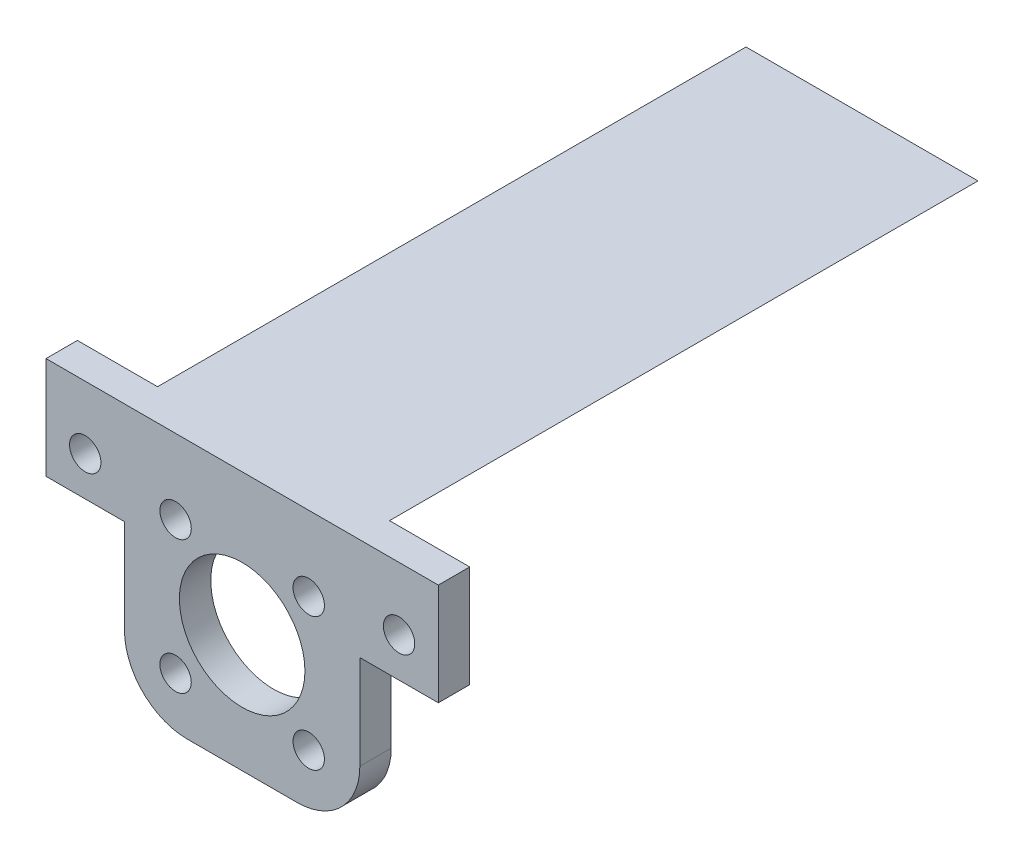
ISO-10303-21;
HEADER;
FILE_DESCRIPTION(('STEP AP214'),'2;1');
FILE_NAME('part.step','',(''),(''),'','','');
FILE_SCHEMA(('AUTOMOTIVE_DESIGN { 1 0 10303 214 1 1 1 1 }'));
ENDSEC;
DATA;
#1=APPLICATION_CONTEXT('core data for automotive mechanical design processes');
#2=APPLICATION_PROTOCOL_DEFINITION('international standard','automotive_design',2000,#1);
#3=PRODUCT_CONTEXT('',#1,'mechanical');
#4=PRODUCT('Part','Part','',(#3));
#5=PRODUCT_RELATED_PRODUCT_CATEGORY('part','',(#4));
#6=PRODUCT_DEFINITION_FORMATION('','',#4);
#7=PRODUCT_DEFINITION_CONTEXT('part definition',#1,'design');
#8=PRODUCT_DEFINITION('design','',#6,#7);
#9=PRODUCT_DEFINITION_SHAPE('','',#8);
#10=(LENGTH_UNIT() NAMED_UNIT(*) SI_UNIT(.MILLI.,.METRE.));
#11=(NAMED_UNIT(*) PLANE_ANGLE_UNIT() SI_UNIT($,.RADIAN.));
#12=(NAMED_UNIT(*) SI_UNIT($,.STERADIAN.) SOLID_ANGLE_UNIT());
#13=UNCERTAINTY_MEASURE_WITH_UNIT(LENGTH_MEASURE(1.E-05),#10,'distance_accuracy_value','');
#14=(GEOMETRIC_REPRESENTATION_CONTEXT(3) GLOBAL_UNCERTAINTY_ASSIGNED_CONTEXT((#13)) GLOBAL_UNIT_ASSIGNED_CONTEXT((#10,
#11,#12)) REPRESENTATION_CONTEXT('',''));
#15=CARTESIAN_POINT('',(0.,0.,0.));
#16=DIRECTION('',(0.,0.,1.));
#17=DIRECTION('',(1.,0.,0.));
#18=AXIS2_PLACEMENT_3D('',#15,#16,#17);
#19=CARTESIAN_POINT('',(-7.,8.,0.));
#20=DIRECTION('',(0.,0.,1.));
#21=DIRECTION('',(1.,0.,0.));
#22=AXIS2_PLACEMENT_3D('',#19,#20,#21);
#23=PLANE('',#22);
#24=CARTESIAN_POINT('',(20.,25.,0.));
#25=DIRECTION('',(0.,0.,1.));
#26=DIRECTION('',(-1.,0.,0.));
#27=AXIS2_PLACEMENT_3D('',#24,#25,#26);
#28=CIRCLE('',#27,2.);
#29=CARTESIAN_POINT('',(18.,25.,0.));
#30=VERTEX_POINT('',#29);
#31=EDGE_CURVE('E159',#30,#30,#28,.T.);
#32=ORIENTED_EDGE('',*,*,#31,.T.);
#33=EDGE_LOOP('',(#32));
#34=FACE_BOUND('',#33,.T.);
#35=CARTESIAN_POINT('',(8.48528137423857,23.4852813742386,0.));
#36=DIRECTION('',(0.,0.,1.));
#37=DIRECTION('',(-1.,0.,0.));
#38=AXIS2_PLACEMENT_3D('',#35,#36,#37);
#39=CIRCLE('',#38,2.);
#40=CARTESIAN_POINT('',(6.48528137423857,23.4852813742386,0.));
#41=VERTEX_POINT('',#40);
#42=EDGE_CURVE('E169',#41,#41,#39,.T.);
#43=ORIENTED_EDGE('',*,*,#42,.T.);
#44=EDGE_LOOP('',(#43));
#45=FACE_BOUND('',#44,.T.);
#46=CARTESIAN_POINT('',(8.48528137423857,6.51471862576143,0.));
#47=DIRECTION('',(0.,0.,1.));
#48=DIRECTION('',(-1.,0.,0.));
#49=AXIS2_PLACEMENT_3D('',#46,#47,#48);
#50=CIRCLE('',#49,2.);
#51=CARTESIAN_POINT('',(6.48528137423857,6.51471862576143,0.));
#52=VERTEX_POINT('',#51);
#53=EDGE_CURVE('E174',#52,#52,#50,.T.);
#54=ORIENTED_EDGE('',*,*,#53,.T.);
#55=EDGE_LOOP('',(#54));
#56=FACE_BOUND('',#55,.T.);
#57=CARTESIAN_POINT('',(-20.,25.,0.));
#58=DIRECTION('',(0.,0.,1.));
#59=DIRECTION('',(1.,0.,0.));
#60=AXIS2_PLACEMENT_3D('',#57,#58,#59);
#61=CIRCLE('',#60,2.);
#62=CARTESIAN_POINT('',(-18.,25.,0.));
#63=VERTEX_POINT('',#62);
#64=EDGE_CURVE('E180',#63,#63,#61,.T.);
#65=ORIENTED_EDGE('',*,*,#64,.T.);
#66=EDGE_LOOP('',(#65));
#67=FACE_BOUND('',#66,.T.);
#68=CARTESIAN_POINT('',(-8.48528137423857,23.4852813742386,0.));
#69=DIRECTION('',(0.,0.,1.));
#70=DIRECTION('',(1.,0.,0.));
#71=AXIS2_PLACEMENT_3D('',#68,#69,#70);
#72=CIRCLE('',#71,2.);
#73=CARTESIAN_POINT('',(-6.48528137423857,23.4852813742386,0.));
#74=VERTEX_POINT('',#73);
#75=EDGE_CURVE('E186',#74,#74,#72,.T.);
#76=ORIENTED_EDGE('',*,*,#75,.T.);
#77=EDGE_LOOP('',(#76));
#78=FACE_BOUND('',#77,.T.);
#79=CARTESIAN_POINT('',(-8.48528137423857,6.51471862576143,0.));
#80=DIRECTION('',(0.,0.,1.));
#81=DIRECTION('',(1.,0.,0.));
#82=AXIS2_PLACEMENT_3D('',#79,#80,#81);
#83=CIRCLE('',#82,2.);
#84=CARTESIAN_POINT('',(-6.48528137423857,6.51471862576143,0.));
#85=VERTEX_POINT('',#84);
#86=EDGE_CURVE('E192',#85,#85,#83,.T.);
#87=ORIENTED_EDGE('',*,*,#86,.T.);
#88=EDGE_LOOP('',(#87));
#89=FACE_BOUND('',#88,.T.);
#90=CARTESIAN_POINT('',(0.,15.,0.));
#91=DIRECTION('',(0.,0.,1.));
#92=DIRECTION('',(1.,0.,0.));
#93=AXIS2_PLACEMENT_3D('',#90,#91,#92);
#94=CIRCLE('',#93,8.);
#95=CARTESIAN_POINT('',(8.,15.,0.));
#96=VERTEX_POINT('',#95);
#97=EDGE_CURVE('E198',#96,#96,#94,.T.);
#98=ORIENTED_EDGE('',*,*,#97,.T.);
#99=EDGE_LOOP('',(#98));
#100=FACE_BOUND('',#99,.T.);
#101=DIRECTION('',(-0.887010833178224,-0.461748613235029,0.));
#102=VECTOR('',#101,1.);
#103=CARTESIAN_POINT('',(-10.3640068647247,19.9090719509428,0.));
#104=LINE('',#103,#102);
#105=CARTESIAN_POINT('',(14.78343194298,33.,0.));
#106=VERTEX_POINT('',#105);
#107=CARTESIAN_POINT('',(9.02048556206639,30.,0.));
#108=VERTEX_POINT('',#107);
#109=EDGE_CURVE('E158',#106,#108,#104,.T.);
#110=ORIENTED_EDGE('',*,*,#109,.F.);
#111=DIRECTION('',(-1.,0.,0.));
#112=VECTOR('',#111,1.);
#113=CARTESIAN_POINT('',(-25.,33.,0.));
#114=LINE('',#113,#112);
#115=CARTESIAN_POINT('',(25.,33.,0.));
#116=VERTEX_POINT('',#115);
#117=EDGE_CURVE('E211',#116,#106,#114,.T.);
#118=ORIENTED_EDGE('',*,*,#117,.F.);
#119=DIRECTION('',(0.,1.,0.));
#120=VECTOR('',#119,1.);
#121=CARTESIAN_POINT('',(25.,33.,0.));
#122=LINE('',#121,#120);
#123=CARTESIAN_POINT('',(25.,20.,0.));
#124=VERTEX_POINT('',#123);
#125=EDGE_CURVE('E246',#124,#116,#122,.T.);
#126=ORIENTED_EDGE('',*,*,#125,.F.);
#127=DIRECTION('',(1.,0.,0.));
#128=VECTOR('',#127,1.);
#129=CARTESIAN_POINT('',(25.,20.,0.));
#130=LINE('',#129,#128);
#131=CARTESIAN_POINT('',(15.,20.,0.));
#132=VERTEX_POINT('',#131);
#133=EDGE_CURVE('E244',#132,#124,#130,.T.);
#134=ORIENTED_EDGE('',*,*,#133,.F.);
#135=DIRECTION('',(0.,1.,0.));
#136=VECTOR('',#135,1.);
#137=CARTESIAN_POINT('',(15.,20.,0.));
#138=LINE('',#137,#136);
#139=CARTESIAN_POINT('',(15.,8.00000000000006,0.));
#140=VERTEX_POINT('',#139);
#141=EDGE_CURVE('E242',#140,#132,#138,.T.);
#142=ORIENTED_EDGE('',*,*,#141,.F.);
#143=CARTESIAN_POINT('',(7.,8.,0.));
#144=DIRECTION('',(0.,0.,1.));
#145=DIRECTION('',(-1.,0.,0.));
#146=AXIS2_PLACEMENT_3D('',#143,#144,#145);
#147=CIRCLE('',#146,8.);
#148=CARTESIAN_POINT('',(6.99999999999994,0.,0.));
#149=VERTEX_POINT('',#148);
#150=EDGE_CURVE('E240',#149,#140,#147,.T.);
#151=ORIENTED_EDGE('',*,*,#150,.F.);
#152=DIRECTION('',(1.,0.,0.));
#153=VECTOR('',#152,1.);
#154=CARTESIAN_POINT('',(-6.99999999999994,0.,0.));
#155=LINE('',#154,#153);
#156=CARTESIAN_POINT('',(-6.99999999999994,0.,0.));
#157=VERTEX_POINT('',#156);
#158=EDGE_CURVE('E238',#157,#149,#155,.T.);
#159=ORIENTED_EDGE('',*,*,#158,.F.);
#160=CARTESIAN_POINT('',(-7.,8.,0.));
#161=DIRECTION('',(0.,0.,1.));
#162=DIRECTION('',(1.,0.,0.));
#163=AXIS2_PLACEMENT_3D('',#160,#161,#162);
#164=CIRCLE('',#163,8.);
#165=CARTESIAN_POINT('',(-15.,8.00000000000006,0.));
#166=VERTEX_POINT('',#165);
#167=EDGE_CURVE('E236',#166,#157,#164,.T.);
#168=ORIENTED_EDGE('',*,*,#167,.F.);
#169=DIRECTION('',(0.,-1.,0.));
#170=VECTOR('',#169,1.);
#171=CARTESIAN_POINT('',(-15.,20.,0.));
#172=LINE('',#171,#170);
#173=CARTESIAN_POINT('',(-15.,20.,0.));
#174=VERTEX_POINT('',#173);
#175=EDGE_CURVE('E234',#174,#166,#172,.T.);
#176=ORIENTED_EDGE('',*,*,#175,.F.);
#177=DIRECTION('',(1.,0.,0.));
#178=VECTOR('',#177,1.);
#179=CARTESIAN_POINT('',(-25.,20.,0.));
#180=LINE('',#179,#178);
#181=CARTESIAN_POINT('',(-25.,20.,0.));
#182=VERTEX_POINT('',#181);
#183=EDGE_CURVE('E232',#182,#174,#180,.T.);
#184=ORIENTED_EDGE('',*,*,#183,.F.);
#185=DIRECTION('',(0.,-1.,0.));
#186=VECTOR('',#185,1.);
#187=CARTESIAN_POINT('',(-25.,33.,0.));
#188=LINE('',#187,#186);
#189=CARTESIAN_POINT('',(-25.,33.,0.));
#190=VERTEX_POINT('',#189);
#191=EDGE_CURVE('E204',#190,#182,#188,.T.);
#192=ORIENTED_EDGE('',*,*,#191,.F.);
#193=CARTESIAN_POINT('',(-14.78343194298,33.,0.));
#194=VERTEX_POINT('',#193);
#195=EDGE_CURVE('E56',#194,#190,#114,.T.);
#196=ORIENTED_EDGE('',*,*,#195,.F.);
#197=DIRECTION('',(0.887010833178224,-0.461748613235029,0.));
#198=VECTOR('',#197,1.);
#199=CARTESIAN_POINT('',(10.3640068647247,19.9090719509428,0.));
#200=LINE('',#199,#198);
#201=CARTESIAN_POINT('',(-9.02048556206639,30.,0.));
#202=VERTEX_POINT('',#201);
#203=EDGE_CURVE('E155',#194,#202,#200,.T.);
#204=ORIENTED_EDGE('',*,*,#203,.T.);
#205=DIRECTION('',(-1.,0.,0.));
#206=VECTOR('',#205,1.);
#207=CARTESIAN_POINT('',(0.,30.,0.));
#208=LINE('',#207,#206);
#209=EDGE_CURVE('E50',#108,#202,#208,.T.);
#210=ORIENTED_EDGE('',*,*,#209,.F.);
#211=EDGE_LOOP('',(#110,#118,#126,#134,#142,#151,#159,#168,#176,#184,#192,#196,#204,#210));
#212=FACE_BOUND('',#211,.T.);
#213=ADVANCED_FACE('F35',(#34,#45,#56,#67,#78,#89,#100,#212),#23,.F.);
#214=CARTESIAN_POINT('',(-7.,8.,4.));
#215=DIRECTION('',(0.,0.,1.));
#216=DIRECTION('',(1.,0.,0.));
#217=AXIS2_PLACEMENT_3D('',#214,#215,#216);
#218=PLANE('',#217);
#219=CARTESIAN_POINT('',(8.48528137423857,23.4852813742386,4.));
#220=DIRECTION('',(0.,0.,1.));
#221=DIRECTION('',(-1.,0.,0.));
#222=AXIS2_PLACEMENT_3D('',#219,#220,#221);
#223=CIRCLE('',#222,2.);
#224=CARTESIAN_POINT('',(6.48528137423857,23.4852813742386,4.));
#225=VERTEX_POINT('',#224);
#226=EDGE_CURVE('E171',#225,#225,#223,.T.);
#227=ORIENTED_EDGE('',*,*,#226,.F.);
#228=EDGE_LOOP('',(#227));
#229=FACE_BOUND('',#228,.T.);
#230=CARTESIAN_POINT('',(-20.,25.,4.));
#231=DIRECTION('',(0.,0.,1.));
#232=DIRECTION('',(1.,0.,0.));
#233=AXIS2_PLACEMENT_3D('',#230,#231,#232);
#234=CIRCLE('',#233,2.);
#235=CARTESIAN_POINT('',(-18.,25.,4.));
#236=VERTEX_POINT('',#235);
#237=EDGE_CURVE('E183',#236,#236,#234,.T.);
#238=ORIENTED_EDGE('',*,*,#237,.F.);
#239=EDGE_LOOP('',(#238));
#240=FACE_BOUND('',#239,.T.);
#241=CARTESIAN_POINT('',(-8.48528137423857,6.51471862576143,4.));
#242=DIRECTION('',(0.,0.,1.));
#243=DIRECTION('',(1.,0.,0.));
#244=AXIS2_PLACEMENT_3D('',#241,#242,#243);
#245=CIRCLE('',#244,2.);
#246=CARTESIAN_POINT('',(-6.48528137423857,6.51471862576143,4.));
#247=VERTEX_POINT('',#246);
#248=EDGE_CURVE('E195',#247,#247,#245,.T.);
#249=ORIENTED_EDGE('',*,*,#248,.F.);
#250=EDGE_LOOP('',(#249));
#251=FACE_BOUND('',#250,.T.);
#252=DIRECTION('',(0.,-1.,0.));
#253=VECTOR('',#252,1.);
#254=CARTESIAN_POINT('',(-25.,33.,4.));
#255=LINE('',#254,#253);
#256=CARTESIAN_POINT('',(-25.,33.,4.));
#257=VERTEX_POINT('',#256);
#258=CARTESIAN_POINT('',(-25.,20.,4.));
#259=VERTEX_POINT('',#258);
#260=EDGE_CURVE('E207',#257,#259,#255,.T.);
#261=ORIENTED_EDGE('',*,*,#260,.T.);
#262=DIRECTION('',(1.,0.,0.));
#263=VECTOR('',#262,1.);
#264=CARTESIAN_POINT('',(-25.,20.,4.));
#265=LINE('',#264,#263);
#266=CARTESIAN_POINT('',(-15.,20.,4.));
#267=VERTEX_POINT('',#266);
#268=EDGE_CURVE('E210',#259,#267,#265,.T.);
#269=ORIENTED_EDGE('',*,*,#268,.T.);
#270=DIRECTION('',(0.,-1.,0.));
#271=VECTOR('',#270,1.);
#272=CARTESIAN_POINT('',(-15.,20.,4.));
#273=LINE('',#272,#271);
#274=CARTESIAN_POINT('',(-15.,8.00000000000006,4.));
#275=VERTEX_POINT('',#274);
#276=EDGE_CURVE('E213',#267,#275,#273,.T.);
#277=ORIENTED_EDGE('',*,*,#276,.T.);
#278=CARTESIAN_POINT('',(-7.,8.,4.));
#279=DIRECTION('',(0.,0.,1.));
#280=DIRECTION('',(1.,0.,0.));
#281=AXIS2_PLACEMENT_3D('',#278,#279,#280);
#282=CIRCLE('',#281,8.);
#283=CARTESIAN_POINT('',(-6.99999999999994,0.,4.));
#284=VERTEX_POINT('',#283);
#285=EDGE_CURVE('E215',#275,#284,#282,.T.);
#286=ORIENTED_EDGE('',*,*,#285,.T.);
#287=DIRECTION('',(1.,0.,0.));
#288=VECTOR('',#287,1.);
#289=CARTESIAN_POINT('',(-6.99999999999994,0.,4.));
#290=LINE('',#289,#288);
#291=CARTESIAN_POINT('',(6.99999999999994,0.,4.));
#292=VERTEX_POINT('',#291);
#293=EDGE_CURVE('E217',#284,#292,#290,.T.);
#294=ORIENTED_EDGE('',*,*,#293,.T.);
#295=CARTESIAN_POINT('',(7.,8.,4.));
#296=DIRECTION('',(0.,0.,1.));
#297=DIRECTION('',(-1.,0.,0.));
#298=AXIS2_PLACEMENT_3D('',#295,#296,#297);
#299=CIRCLE('',#298,8.);
#300=CARTESIAN_POINT('',(15.,8.00000000000006,4.));
#301=VERTEX_POINT('',#300);
#302=EDGE_CURVE('E219',#292,#301,#299,.T.);
#303=ORIENTED_EDGE('',*,*,#302,.T.);
#304=DIRECTION('',(0.,1.,0.));
#305=VECTOR('',#304,1.);
#306=CARTESIAN_POINT('',(15.,20.,4.));
#307=LINE('',#306,#305);
#308=CARTESIAN_POINT('',(15.,20.,4.));
#309=VERTEX_POINT('',#308);
#310=EDGE_CURVE('E221',#301,#309,#307,.T.);
#311=ORIENTED_EDGE('',*,*,#310,.T.);
#312=DIRECTION('',(1.,0.,0.));
#313=VECTOR('',#312,1.);
#314=CARTESIAN_POINT('',(25.,20.,4.));
#315=LINE('',#314,#313);
#316=CARTESIAN_POINT('',(25.,20.,4.));
#317=VERTEX_POINT('',#316);
#318=EDGE_CURVE('E223',#309,#317,#315,.T.);
#319=ORIENTED_EDGE('',*,*,#318,.T.);
#320=DIRECTION('',(0.,1.,0.));
#321=VECTOR('',#320,1.);
#322=CARTESIAN_POINT('',(25.,33.,4.));
#323=LINE('',#322,#321);
#324=CARTESIAN_POINT('',(25.,33.,4.));
#325=VERTEX_POINT('',#324);
#326=EDGE_CURVE('E225',#317,#325,#323,.T.);
#327=ORIENTED_EDGE('',*,*,#326,.T.);
#328=DIRECTION('',(-1.,0.,0.));
#329=VECTOR('',#328,1.);
#330=CARTESIAN_POINT('',(-25.,33.,4.));
#331=LINE('',#330,#329);
#332=EDGE_CURVE('E227',#325,#257,#331,.T.);
#333=ORIENTED_EDGE('',*,*,#332,.T.);
#334=EDGE_LOOP('',(#261,#269,#277,#286,#294,#303,#311,#319,#327,#333));
#335=FACE_BOUND('',#334,.T.);
#336=CARTESIAN_POINT('',(0.,15.,4.));
#337=DIRECTION('',(0.,0.,1.));
#338=DIRECTION('',(1.,0.,0.));
#339=AXIS2_PLACEMENT_3D('',#336,#337,#338);
#340=CIRCLE('',#339,8.);
#341=CARTESIAN_POINT('',(8.,15.,4.));
#342=VERTEX_POINT('',#341);
#343=EDGE_CURVE('E201',#342,#342,#340,.T.);
#344=ORIENTED_EDGE('',*,*,#343,.F.);
#345=EDGE_LOOP('',(#344));
#346=FACE_BOUND('',#345,.T.);
#347=CARTESIAN_POINT('',(-8.48528137423857,23.4852813742386,4.));
#348=DIRECTION('',(0.,0.,1.));
#349=DIRECTION('',(1.,0.,0.));
#350=AXIS2_PLACEMENT_3D('',#347,#348,#349);
#351=CIRCLE('',#350,2.);
#352=CARTESIAN_POINT('',(-6.48528137423857,23.4852813742386,4.));
#353=VERTEX_POINT('',#352);
#354=EDGE_CURVE('E189',#353,#353,#351,.T.);
#355=ORIENTED_EDGE('',*,*,#354,.F.);
#356=EDGE_LOOP('',(#355));
#357=FACE_BOUND('',#356,.T.);
#358=CARTESIAN_POINT('',(8.48528137423857,6.51471862576143,4.));
#359=DIRECTION('',(0.,0.,1.));
#360=DIRECTION('',(-1.,0.,0.));
#361=AXIS2_PLACEMENT_3D('',#358,#359,#360);
#362=CIRCLE('',#361,2.);
#363=CARTESIAN_POINT('',(6.48528137423857,6.51471862576143,4.));
#364=VERTEX_POINT('',#363);
#365=EDGE_CURVE('E177',#364,#364,#362,.T.);
#366=ORIENTED_EDGE('',*,*,#365,.F.);
#367=EDGE_LOOP('',(#366));
#368=FACE_BOUND('',#367,.T.);
#369=CARTESIAN_POINT('',(20.,25.,4.));
#370=DIRECTION('',(0.,0.,1.));
#371=DIRECTION('',(-1.,0.,0.));
#372=AXIS2_PLACEMENT_3D('',#369,#370,#371);
#373=CIRCLE('',#372,2.);
#374=CARTESIAN_POINT('',(18.,25.,4.));
#375=VERTEX_POINT('',#374);
#376=EDGE_CURVE('E162',#375,#375,#373,.T.);
#377=ORIENTED_EDGE('',*,*,#376,.F.);
#378=EDGE_LOOP('',(#377));
#379=FACE_BOUND('',#378,.T.);
#380=ADVANCED_FACE('F293',(#229,#240,#251,#335,#346,#357,#368,#379),#218,.T.);
#381=CARTESIAN_POINT('',(-25.,33.,4.));
#382=DIRECTION('',(1.,0.,0.));
#383=DIRECTION('',(0.,0.,-1.));
#384=AXIS2_PLACEMENT_3D('',#381,#382,#383);
#385=PLANE('',#384);
#386=ORIENTED_EDGE('',*,*,#191,.T.);
#387=DIRECTION('',(0.,0.,-1.));
#388=VECTOR('',#387,1.);
#389=CARTESIAN_POINT('',(-25.,20.,4.));
#390=LINE('',#389,#388);
#391=EDGE_CURVE('E11',#259,#182,#390,.T.);
#392=ORIENTED_EDGE('',*,*,#391,.F.);
#393=ORIENTED_EDGE('',*,*,#260,.F.);
#394=DIRECTION('',(0.,0.,-1.));
#395=VECTOR('',#394,1.);
#396=CARTESIAN_POINT('',(-25.,33.,4.));
#397=LINE('',#396,#395);
#398=EDGE_CURVE('E229',#257,#190,#397,.T.);
#399=ORIENTED_EDGE('',*,*,#398,.T.);
#400=EDGE_LOOP('',(#386,#392,#393,#399));
#401=FACE_BOUND('',#400,.T.);
#402=ADVANCED_FACE('F37',(#401),#385,.F.);
#403=CARTESIAN_POINT('',(-25.,20.,4.));
#404=DIRECTION('',(0.,1.,0.));
#405=DIRECTION('',(0.,0.,1.));
#406=AXIS2_PLACEMENT_3D('',#403,#404,#405);
#407=PLANE('',#406);
#408=ORIENTED_EDGE('',*,*,#183,.T.);
#409=DIRECTION('',(0.,0.,-1.));
#410=VECTOR('',#409,1.);
#411=CARTESIAN_POINT('',(-15.,20.,4.));
#412=LINE('',#411,#410);
#413=EDGE_CURVE('E43',#267,#174,#412,.T.);
#414=ORIENTED_EDGE('',*,*,#413,.F.);
#415=ORIENTED_EDGE('',*,*,#268,.F.);
#416=ORIENTED_EDGE('',*,*,#391,.T.);
#417=EDGE_LOOP('',(#408,#414,#415,#416));
#418=FACE_BOUND('',#417,.T.);
#419=ADVANCED_FACE('F298',(#418),#407,.F.);
#420=CARTESIAN_POINT('',(-15.,20.,4.));
#421=DIRECTION('',(1.,0.,0.));
#422=DIRECTION('',(0.,0.,-1.));
#423=AXIS2_PLACEMENT_3D('',#420,#421,#422);
#424=PLANE('',#423);
#425=ORIENTED_EDGE('',*,*,#175,.T.);
#426=DIRECTION('',(0.,0.,-1.));
#427=VECTOR('',#426,1.);
#428=CARTESIAN_POINT('',(-15.,8.00000000000006,4.));
#429=LINE('',#428,#427);
#430=EDGE_CURVE('E270',#275,#166,#429,.T.);
#431=ORIENTED_EDGE('',*,*,#430,.F.);
#432=ORIENTED_EDGE('',*,*,#276,.F.);
#433=ORIENTED_EDGE('',*,*,#413,.T.);
#434=EDGE_LOOP('',(#425,#431,#432,#433));
#435=FACE_BOUND('',#434,.T.);
#436=ADVANCED_FACE('F277',(#435),#424,.F.);
#437=CARTESIAN_POINT('',(-7.,8.,4.));
#438=DIRECTION('',(0.,0.,-1.));
#439=DIRECTION('',(-1.,0.,0.));
#440=AXIS2_PLACEMENT_3D('',#437,#438,#439);
#441=CYLINDRICAL_SURFACE('',#440,8.);
#442=ORIENTED_EDGE('',*,*,#167,.T.);
#443=DIRECTION('',(0.,0.,-1.));
#444=VECTOR('',#443,1.);
#445=CARTESIAN_POINT('',(-6.99999999999994,0.,4.));
#446=LINE('',#445,#444);
#447=EDGE_CURVE('E267',#284,#157,#446,.T.);
#448=ORIENTED_EDGE('',*,*,#447,.F.);
#449=ORIENTED_EDGE('',*,*,#285,.F.);
#450=ORIENTED_EDGE('',*,*,#430,.T.);
#451=EDGE_LOOP('',(#442,#448,#449,#450));
#452=FACE_BOUND('',#451,.T.);
#453=ADVANCED_FACE('F285',(#452),#441,.T.);
#454=CARTESIAN_POINT('',(-6.99999999999994,0.,4.));
#455=DIRECTION('',(0.,1.,0.));
#456=DIRECTION('',(0.,0.,1.));
#457=AXIS2_PLACEMENT_3D('',#454,#455,#456);
#458=PLANE('',#457);
#459=ORIENTED_EDGE('',*,*,#158,.T.);
#460=DIRECTION('',(0.,0.,-1.));
#461=VECTOR('',#460,1.);
#462=CARTESIAN_POINT('',(6.99999999999994,0.,4.));
#463=LINE('',#462,#461);
#464=EDGE_CURVE('E264',#292,#149,#463,.T.);
#465=ORIENTED_EDGE('',*,*,#464,.F.);
#466=ORIENTED_EDGE('',*,*,#293,.F.);
#467=ORIENTED_EDGE('',*,*,#447,.T.);
#468=EDGE_LOOP('',(#459,#465,#466,#467));
#469=FACE_BOUND('',#468,.T.);
#470=ADVANCED_FACE('F289',(#469),#458,.F.);
#471=CARTESIAN_POINT('',(7.,8.,4.));
#472=DIRECTION('',(0.,0.,-1.));
#473=DIRECTION('',(-1.,0.,0.));
#474=AXIS2_PLACEMENT_3D('',#471,#472,#473);
#475=CYLINDRICAL_SURFACE('',#474,8.);
#476=ORIENTED_EDGE('',*,*,#150,.T.);
#477=DIRECTION('',(0.,0.,-1.));
#478=VECTOR('',#477,1.);
#479=CARTESIAN_POINT('',(15.,8.00000000000006,4.));
#480=LINE('',#479,#478);
#481=EDGE_CURVE('E261',#301,#140,#480,.T.);
#482=ORIENTED_EDGE('',*,*,#481,.F.);
#483=ORIENTED_EDGE('',*,*,#302,.F.);
#484=ORIENTED_EDGE('',*,*,#464,.T.);
#485=EDGE_LOOP('',(#476,#482,#483,#484));
#486=FACE_BOUND('',#485,.T.);
#487=ADVANCED_FACE('F331',(#486),#475,.T.);
#488=CARTESIAN_POINT('',(15.,20.,4.));
#489=DIRECTION('',(-1.,0.,0.));
#490=DIRECTION('',(0.,0.,1.));
#491=AXIS2_PLACEMENT_3D('',#488,#489,#490);
#492=PLANE('',#491);
#493=ORIENTED_EDGE('',*,*,#141,.T.);
#494=DIRECTION('',(0.,0.,-1.));
#495=VECTOR('',#494,1.);
#496=CARTESIAN_POINT('',(15.,20.,4.));
#497=LINE('',#496,#495);
#498=EDGE_CURVE('E258',#309,#132,#497,.T.);
#499=ORIENTED_EDGE('',*,*,#498,.F.);
#500=ORIENTED_EDGE('',*,*,#310,.F.);
#501=ORIENTED_EDGE('',*,*,#481,.T.);
#502=EDGE_LOOP('',(#493,#499,#500,#501));
#503=FACE_BOUND('',#502,.T.);
#504=ADVANCED_FACE('F329',(#503),#492,.F.);
#505=CARTESIAN_POINT('',(25.,20.,4.));
#506=DIRECTION('',(0.,1.,0.));
#507=DIRECTION('',(0.,0.,1.));
#508=AXIS2_PLACEMENT_3D('',#505,#506,#507);
#509=PLANE('',#508);
#510=ORIENTED_EDGE('',*,*,#133,.T.);
#511=DIRECTION('',(0.,0.,-1.));
#512=VECTOR('',#511,1.);
#513=CARTESIAN_POINT('',(25.,20.,4.));
#514=LINE('',#513,#512);
#515=EDGE_CURVE('E255',#317,#124,#514,.T.);
#516=ORIENTED_EDGE('',*,*,#515,.F.);
#517=ORIENTED_EDGE('',*,*,#318,.F.);
#518=ORIENTED_EDGE('',*,*,#498,.T.);
#519=EDGE_LOOP('',(#510,#516,#517,#518));
#520=FACE_BOUND('',#519,.T.);
#521=ADVANCED_FACE('F325',(#520),#509,.F.);
#522=CARTESIAN_POINT('',(25.,33.,4.));
#523=DIRECTION('',(-1.,0.,0.));
#524=DIRECTION('',(0.,0.,1.));
#525=AXIS2_PLACEMENT_3D('',#522,#523,#524);
#526=PLANE('',#525);
#527=ORIENTED_EDGE('',*,*,#125,.T.);
#528=DIRECTION('',(0.,0.,-1.));
#529=VECTOR('',#528,1.);
#530=CARTESIAN_POINT('',(25.,33.,4.));
#531=LINE('',#530,#529);
#532=EDGE_CURVE('E252',#325,#116,#531,.T.);
#533=ORIENTED_EDGE('',*,*,#532,.F.);
#534=ORIENTED_EDGE('',*,*,#326,.F.);
#535=ORIENTED_EDGE('',*,*,#515,.T.);
#536=EDGE_LOOP('',(#527,#533,#534,#535));
#537=FACE_BOUND('',#536,.T.);
#538=ADVANCED_FACE('F320',(#537),#526,.F.);
#539=CARTESIAN_POINT('',(-25.,33.,4.));
#540=DIRECTION('',(0.,-1.,0.));
#541=DIRECTION('',(0.,0.,-1.));
#542=AXIS2_PLACEMENT_3D('',#539,#540,#541);
#543=PLANE('',#542);
#544=ORIENTED_EDGE('',*,*,#117,.T.);
#545=DIRECTION('',(0.,0.,1.));
#546=VECTOR('',#545,1.);
#547=CARTESIAN_POINT('',(14.78343194298,33.,-75.));
#548=LINE('',#547,#546);
#549=CARTESIAN_POINT('',(14.78343194298,33.,-75.));
#550=VERTEX_POINT('',#549);
#551=EDGE_CURVE('E306',#550,#106,#548,.T.);
#552=ORIENTED_EDGE('',*,*,#551,.F.);
#553=DIRECTION('',(1.,0.,0.));
#554=VECTOR('',#553,1.);
#555=CARTESIAN_POINT('',(0.,33.,-75.));
#556=LINE('',#555,#554);
#557=CARTESIAN_POINT('',(-14.78343194298,33.,-75.));
#558=VERTEX_POINT('',#557);
#559=EDGE_CURVE('E151',#558,#550,#556,.T.);
#560=ORIENTED_EDGE('',*,*,#559,.F.);
#561=DIRECTION('',(0.,0.,1.));
#562=VECTOR('',#561,1.);
#563=CARTESIAN_POINT('',(-14.78343194298,33.,-75.));
#564=LINE('',#563,#562);
#565=EDGE_CURVE('E164',#558,#194,#564,.T.);
#566=ORIENTED_EDGE('',*,*,#565,.T.);
#567=ORIENTED_EDGE('',*,*,#195,.T.);
#568=ORIENTED_EDGE('',*,*,#398,.F.);
#569=ORIENTED_EDGE('',*,*,#332,.F.);
#570=ORIENTED_EDGE('',*,*,#532,.T.);
#571=EDGE_LOOP('',(#544,#552,#560,#566,#567,#568,#569,#570));
#572=FACE_BOUND('',#571,.T.);
#573=ADVANCED_FACE('F303',(#572),#543,.F.);
#574=CARTESIAN_POINT('',(0.,15.,4.));
#575=DIRECTION('',(0.,0.,-1.));
#576=DIRECTION('',(-1.,0.,0.));
#577=AXIS2_PLACEMENT_3D('',#574,#575,#576);
#578=CYLINDRICAL_SURFACE('',#577,8.);
#579=ORIENTED_EDGE('',*,*,#343,.T.);
#580=EDGE_LOOP('',(#579));
#581=FACE_BOUND('',#580,.T.);
#582=ORIENTED_EDGE('',*,*,#97,.F.);
#583=EDGE_LOOP('',(#582));
#584=FACE_BOUND('',#583,.T.);
#585=ADVANCED_FACE('F353',(#581,#584),#578,.F.);
#586=CARTESIAN_POINT('',(-8.48528137423857,6.51471862576143,4.));
#587=DIRECTION('',(0.,0.,-1.));
#588=DIRECTION('',(-1.,0.,0.));
#589=AXIS2_PLACEMENT_3D('',#586,#587,#588);
#590=CYLINDRICAL_SURFACE('',#589,2.);
#591=ORIENTED_EDGE('',*,*,#248,.T.);
#592=EDGE_LOOP('',(#591));
#593=FACE_BOUND('',#592,.T.);
#594=ORIENTED_EDGE('',*,*,#86,.F.);
#595=EDGE_LOOP('',(#594));
#596=FACE_BOUND('',#595,.T.);
#597=ADVANCED_FACE('F376',(#593,#596),#590,.F.);
#598=CARTESIAN_POINT('',(-8.48528137423857,23.4852813742386,4.));
#599=DIRECTION('',(0.,0.,-1.));
#600=DIRECTION('',(-1.,0.,0.));
#601=AXIS2_PLACEMENT_3D('',#598,#599,#600);
#602=CYLINDRICAL_SURFACE('',#601,2.);
#603=ORIENTED_EDGE('',*,*,#354,.T.);
#604=EDGE_LOOP('',(#603));
#605=FACE_BOUND('',#604,.T.);
#606=ORIENTED_EDGE('',*,*,#75,.F.);
#607=EDGE_LOOP('',(#606));
#608=FACE_BOUND('',#607,.T.);
#609=ADVANCED_FACE('F383',(#605,#608),#602,.F.);
#610=CARTESIAN_POINT('',(-20.,25.,4.));
#611=DIRECTION('',(0.,0.,-1.));
#612=DIRECTION('',(-1.,0.,0.));
#613=AXIS2_PLACEMENT_3D('',#610,#611,#612);
#614=CYLINDRICAL_SURFACE('',#613,2.);
#615=ORIENTED_EDGE('',*,*,#237,.T.);
#616=EDGE_LOOP('',(#615));
#617=FACE_BOUND('',#616,.T.);
#618=ORIENTED_EDGE('',*,*,#64,.F.);
#619=EDGE_LOOP('',(#618));
#620=FACE_BOUND('',#619,.T.);
#621=ADVANCED_FACE('F391',(#617,#620),#614,.F.);
#622=CARTESIAN_POINT('',(8.48528137423857,6.51471862576143,4.));
#623=DIRECTION('',(0.,0.,-1.));
#624=DIRECTION('',(-1.,0.,0.));
#625=AXIS2_PLACEMENT_3D('',#622,#623,#624);
#626=CYLINDRICAL_SURFACE('',#625,2.);
#627=ORIENTED_EDGE('',*,*,#365,.T.);
#628=EDGE_LOOP('',(#627));
#629=FACE_BOUND('',#628,.T.);
#630=ORIENTED_EDGE('',*,*,#53,.F.);
#631=EDGE_LOOP('',(#630));
#632=FACE_BOUND('',#631,.T.);
#633=ADVANCED_FACE('F399',(#629,#632),#626,.F.);
#634=CARTESIAN_POINT('',(8.48528137423857,23.4852813742386,4.));
#635=DIRECTION('',(0.,0.,-1.));
#636=DIRECTION('',(-1.,0.,0.));
#637=AXIS2_PLACEMENT_3D('',#634,#635,#636);
#638=CYLINDRICAL_SURFACE('',#637,2.);
#639=ORIENTED_EDGE('',*,*,#226,.T.);
#640=EDGE_LOOP('',(#639));
#641=FACE_BOUND('',#640,.T.);
#642=ORIENTED_EDGE('',*,*,#42,.F.);
#643=EDGE_LOOP('',(#642));
#644=FACE_BOUND('',#643,.T.);
#645=ADVANCED_FACE('F407',(#641,#644),#638,.F.);
#646=CARTESIAN_POINT('',(20.,25.,4.));
#647=DIRECTION('',(0.,0.,-1.));
#648=DIRECTION('',(-1.,0.,0.));
#649=AXIS2_PLACEMENT_3D('',#646,#647,#648);
#650=CYLINDRICAL_SURFACE('',#649,2.);
#651=ORIENTED_EDGE('',*,*,#376,.T.);
#652=EDGE_LOOP('',(#651));
#653=FACE_BOUND('',#652,.T.);
#654=ORIENTED_EDGE('',*,*,#31,.F.);
#655=EDGE_LOOP('',(#654));
#656=FACE_BOUND('',#655,.T.);
#657=ADVANCED_FACE('F415',(#653,#656),#650,.F.);
#658=CARTESIAN_POINT('',(-10.3640068647247,19.9090719509428,-75.));
#659=DIRECTION('',(-0.461748613235029,0.887010833178224,0.));
#660=DIRECTION('',(-0.887010833178224,-0.461748613235029,0.));
#661=AXIS2_PLACEMENT_3D('',#658,#659,#660);
#662=PLANE('',#661);
#663=ORIENTED_EDGE('',*,*,#109,.T.);
#664=DIRECTION('',(0.,0.,1.));
#665=VECTOR('',#664,1.);
#666=CARTESIAN_POINT('',(9.02048556206639,30.,-75.));
#667=LINE('',#666,#665);
#668=CARTESIAN_POINT('',(9.02048556206639,30.,-75.));
#669=VERTEX_POINT('',#668);
#670=EDGE_CURVE('E138',#669,#108,#667,.T.);
#671=ORIENTED_EDGE('',*,*,#670,.F.);
#672=DIRECTION('',(-0.887010833178224,-0.461748613235029,0.));
#673=VECTOR('',#672,1.);
#674=CARTESIAN_POINT('',(-10.3640068647247,19.9090719509428,-75.));
#675=LINE('',#674,#673);
#676=EDGE_CURVE('E146',#550,#669,#675,.T.);
#677=ORIENTED_EDGE('',*,*,#676,.F.);
#678=ORIENTED_EDGE('',*,*,#551,.T.);
#679=EDGE_LOOP('',(#663,#671,#677,#678));
#680=FACE_BOUND('',#679,.T.);
#681=ADVANCED_FACE('F157',(#680),#662,.F.);
#682=CARTESIAN_POINT('',(0.,30.,-75.));
#683=DIRECTION('',(0.,1.,0.));
#684=DIRECTION('',(0.,0.,1.));
#685=AXIS2_PLACEMENT_3D('',#682,#683,#684);
#686=PLANE('',#685);
#687=ORIENTED_EDGE('',*,*,#209,.T.);
#688=DIRECTION('',(0.,0.,1.));
#689=VECTOR('',#688,1.);
#690=CARTESIAN_POINT('',(-9.02048556206639,30.,-75.));
#691=LINE('',#690,#689);
#692=CARTESIAN_POINT('',(-9.02048556206639,30.,-75.));
#693=VERTEX_POINT('',#692);
#694=EDGE_CURVE('E141',#693,#202,#691,.T.);
#695=ORIENTED_EDGE('',*,*,#694,.F.);
#696=DIRECTION('',(-1.,0.,0.));
#697=VECTOR('',#696,1.);
#698=CARTESIAN_POINT('',(0.,30.,-75.));
#699=LINE('',#698,#697);
#700=EDGE_CURVE('E134',#669,#693,#699,.T.);
#701=ORIENTED_EDGE('',*,*,#700,.F.);
#702=ORIENTED_EDGE('',*,*,#670,.T.);
#703=EDGE_LOOP('',(#687,#695,#701,#702));
#704=FACE_BOUND('',#703,.T.);
#705=ADVANCED_FACE('F136',(#704),#686,.F.);
#706=CARTESIAN_POINT('',(10.3640068647247,19.9090719509428,-75.));
#707=DIRECTION('',(-0.461748613235029,-0.887010833178224,0.));
#708=DIRECTION('',(0.887010833178224,-0.461748613235029,0.));
#709=AXIS2_PLACEMENT_3D('',#706,#707,#708);
#710=PLANE('',#709);
#711=ORIENTED_EDGE('',*,*,#203,.F.);
#712=ORIENTED_EDGE('',*,*,#565,.F.);
#713=DIRECTION('',(0.887010833178224,-0.461748613235029,0.));
#714=VECTOR('',#713,1.);
#715=CARTESIAN_POINT('',(10.3640068647247,19.9090719509428,-75.));
#716=LINE('',#715,#714);
#717=EDGE_CURVE('E145',#558,#693,#716,.T.);
#718=ORIENTED_EDGE('',*,*,#717,.T.);
#719=ORIENTED_EDGE('',*,*,#694,.T.);
#720=EDGE_LOOP('',(#711,#712,#718,#719));
#721=FACE_BOUND('',#720,.T.);
#722=ADVANCED_FACE('F307',(#721),#710,.T.);
#723=CARTESIAN_POINT('',(0.,0.,-75.));
#724=DIRECTION('',(0.,0.,-1.));
#725=DIRECTION('',(-1.,0.,0.));
#726=AXIS2_PLACEMENT_3D('',#723,#724,#725);
#727=PLANE('',#726);
#728=ORIENTED_EDGE('',*,*,#676,.T.);
#729=ORIENTED_EDGE('',*,*,#700,.T.);
#730=ORIENTED_EDGE('',*,*,#717,.F.);
#731=ORIENTED_EDGE('',*,*,#559,.T.);
#732=EDGE_LOOP('',(#728,#729,#730,#731));
#733=FACE_BOUND('',#732,.T.);
#734=ADVANCED_FACE('F149',(#733),#727,.T.);
#735=CLOSED_SHELL('',(#213,#380,#402,#419,#436,#453,#470,#487,#504,#521,#538,#573,#585,#597,
#609,#621,#633,#645,#657,#681,#705,#722,#734));
#736=MANIFOLD_SOLID_BREP('B2',#735);
#737=ADVANCED_BREP_SHAPE_REPRESENTATION('',(#18,#736),#14);
#738=SHAPE_DEFINITION_REPRESENTATION(#9,#737);
ENDSEC;
END-ISO-10303-21;
